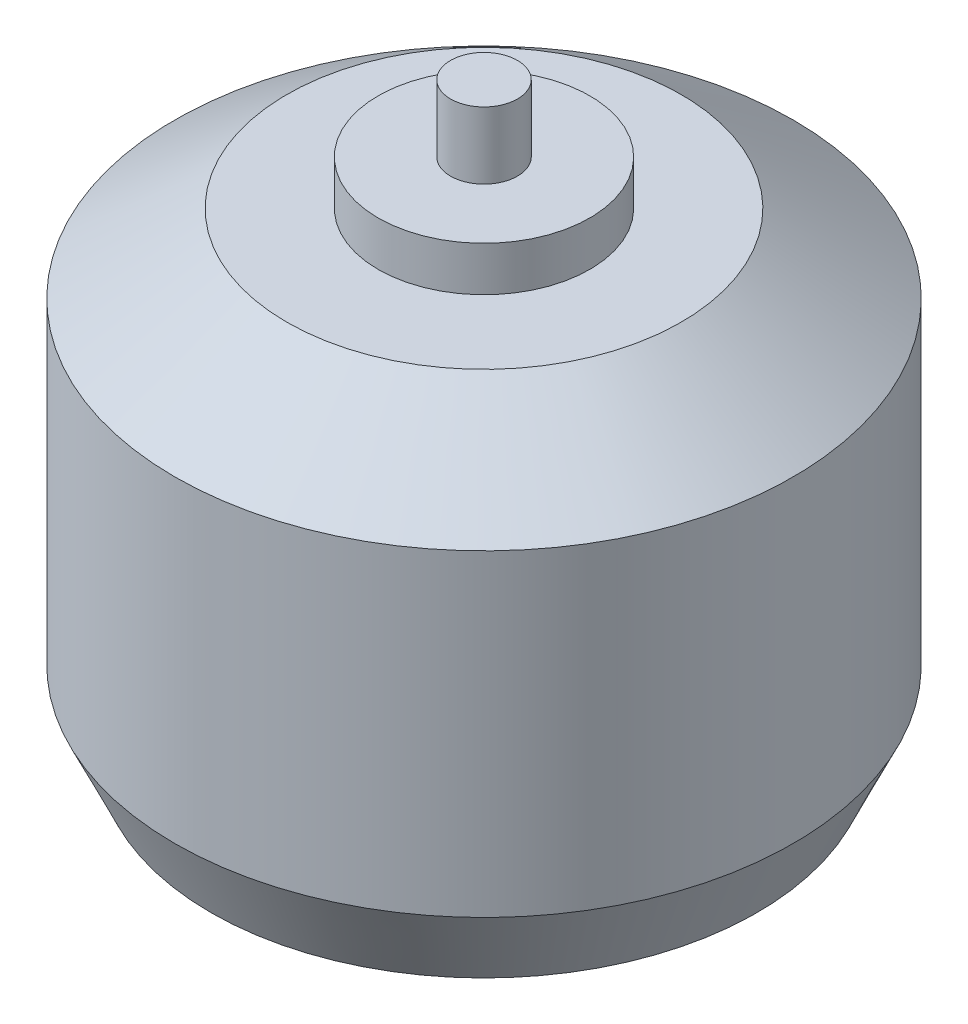
ISO-10303-21;
HEADER;
FILE_DESCRIPTION(('STEP AP214'),'2;1');
FILE_NAME('part.step','',(''),(''),'','','');
FILE_SCHEMA(('AUTOMOTIVE_DESIGN { 1 0 10303 214 1 1 1 1 }'));
ENDSEC;
DATA;
#1=APPLICATION_CONTEXT('core data for automotive mechanical design processes');
#2=APPLICATION_PROTOCOL_DEFINITION('international standard','automotive_design',2000,#1);
#3=PRODUCT_CONTEXT('',#1,'mechanical');
#4=PRODUCT('Part','Part','',(#3));
#5=PRODUCT_RELATED_PRODUCT_CATEGORY('part','',(#4));
#6=PRODUCT_DEFINITION_FORMATION('','',#4);
#7=PRODUCT_DEFINITION_CONTEXT('part definition',#1,'design');
#8=PRODUCT_DEFINITION('design','',#6,#7);
#9=PRODUCT_DEFINITION_SHAPE('','',#8);
#10=(LENGTH_UNIT() NAMED_UNIT(*) SI_UNIT(.MILLI.,.METRE.));
#11=(NAMED_UNIT(*) PLANE_ANGLE_UNIT() SI_UNIT($,.RADIAN.));
#12=(NAMED_UNIT(*) SI_UNIT($,.STERADIAN.) SOLID_ANGLE_UNIT());
#13=UNCERTAINTY_MEASURE_WITH_UNIT(LENGTH_MEASURE(1.E-05),#10,'distance_accuracy_value','');
#14=(GEOMETRIC_REPRESENTATION_CONTEXT(3) GLOBAL_UNCERTAINTY_ASSIGNED_CONTEXT((#13)) GLOBAL_UNIT_ASSIGNED_CONTEXT((#10,
#11,#12)) REPRESENTATION_CONTEXT('',''));
#15=CARTESIAN_POINT('',(0.,0.,0.));
#16=DIRECTION('',(0.,0.,1.));
#17=DIRECTION('',(1.,0.,0.));
#18=AXIS2_PLACEMENT_3D('',#15,#16,#17);
#19=CARTESIAN_POINT('',(0.,0.,0.));
#20=DIRECTION('',(0.,-1.,0.));
#21=DIRECTION('',(0.,0.,-1.));
#22=AXIS2_PLACEMENT_3D('',#19,#20,#21);
#23=PLANE('',#22);
#24=CARTESIAN_POINT('',(0.,0.,0.));
#25=DIRECTION('',(0.,1.,0.));
#26=DIRECTION('',(0.,0.,1.));
#27=AXIS2_PLACEMENT_3D('',#24,#25,#26);
#28=CIRCLE('',#27,12.25);
#29=CARTESIAN_POINT('',(0.,0.,12.25));
#30=VERTEX_POINT('',#29);
#31=EDGE_CURVE('E10',#30,#30,#28,.T.);
#32=ORIENTED_EDGE('',*,*,#31,.F.);
#33=EDGE_LOOP('',(#32));
#34=FACE_BOUND('',#33,.T.);
#35=ADVANCED_FACE('F31',(#34),#23,.T.);
#36=CARTESIAN_POINT('',(0.,3.5,0.));
#37=DIRECTION('',(0.,1.,0.));
#38=DIRECTION('',(0.,0.,1.));
#39=AXIS2_PLACEMENT_3D('',#36,#37,#38);
#40=CONICAL_SURFACE('',#39,13.875,0.434670215149244);
#41=ORIENTED_EDGE('',*,*,#31,.T.);
#42=EDGE_LOOP('',(#41));
#43=FACE_BOUND('',#42,.T.);
#44=CARTESIAN_POINT('',(0.,3.5,0.));
#45=DIRECTION('',(0.,1.,0.));
#46=DIRECTION('',(0.,0.,1.));
#47=AXIS2_PLACEMENT_3D('',#44,#45,#46);
#48=CIRCLE('',#47,13.875);
#49=CARTESIAN_POINT('',(0.,3.5,13.875));
#50=VERTEX_POINT('',#49);
#51=EDGE_CURVE('E37',#50,#50,#48,.T.);
#52=ORIENTED_EDGE('',*,*,#51,.F.);
#53=EDGE_LOOP('',(#52));
#54=FACE_BOUND('',#53,.T.);
#55=ADVANCED_FACE('F79',(#43,#54),#40,.T.);
#56=CARTESIAN_POINT('',(0.,26.25,0.));
#57=DIRECTION('',(0.,1.,0.));
#58=DIRECTION('',(0.,0.,1.));
#59=AXIS2_PLACEMENT_3D('',#56,#57,#58);
#60=CYLINDRICAL_SURFACE('',#59,13.875);
#61=ORIENTED_EDGE('',*,*,#51,.T.);
#62=EDGE_LOOP('',(#61));
#63=FACE_BOUND('',#62,.T.);
#64=CARTESIAN_POINT('',(0.,17.75,0.));
#65=DIRECTION('',(0.,1.,0.));
#66=DIRECTION('',(0.,0.,1.));
#67=AXIS2_PLACEMENT_3D('',#64,#65,#66);
#68=CIRCLE('',#67,13.875);
#69=CARTESIAN_POINT('',(0.,17.75,13.875));
#70=VERTEX_POINT('',#69);
#71=EDGE_CURVE('E41',#70,#70,#68,.T.);
#72=ORIENTED_EDGE('',*,*,#71,.F.);
#73=EDGE_LOOP('',(#72));
#74=FACE_BOUND('',#73,.T.);
#75=ADVANCED_FACE('F84',(#63,#74),#60,.T.);
#76=CARTESIAN_POINT('',(0.,21.25,0.));
#77=DIRECTION('',(0.,-1.,0.));
#78=DIRECTION('',(0.,0.,-1.));
#79=AXIS2_PLACEMENT_3D('',#76,#77,#78);
#80=CONICAL_SURFACE('',#79,8.85,0.96241149525225);
#81=ORIENTED_EDGE('',*,*,#71,.T.);
#82=EDGE_LOOP('',(#81));
#83=FACE_BOUND('',#82,.T.);
#84=CARTESIAN_POINT('',(0.,21.25,0.));
#85=DIRECTION('',(0.,1.,0.));
#86=DIRECTION('',(0.,0.,1.));
#87=AXIS2_PLACEMENT_3D('',#84,#85,#86);
#88=CIRCLE('',#87,8.85);
#89=CARTESIAN_POINT('',(0.,21.25,8.85));
#90=VERTEX_POINT('',#89);
#91=EDGE_CURVE('E45',#90,#90,#88,.T.);
#92=ORIENTED_EDGE('',*,*,#91,.F.);
#93=EDGE_LOOP('',(#92));
#94=FACE_BOUND('',#93,.T.);
#95=ADVANCED_FACE('F88',(#83,#94),#80,.T.);
#96=CARTESIAN_POINT('',(0.,21.25,8.85));
#97=DIRECTION('',(0.,1.,0.));
#98=DIRECTION('',(0.,0.,1.));
#99=AXIS2_PLACEMENT_3D('',#96,#97,#98);
#100=PLANE('',#99);
#101=ORIENTED_EDGE('',*,*,#91,.T.);
#102=EDGE_LOOP('',(#101));
#103=FACE_BOUND('',#102,.T.);
#104=CARTESIAN_POINT('',(0.,21.25,0.));
#105=DIRECTION('',(0.,1.,0.));
#106=DIRECTION('',(0.,0.,1.));
#107=AXIS2_PLACEMENT_3D('',#104,#105,#106);
#108=CIRCLE('',#107,4.75);
#109=CARTESIAN_POINT('',(0.,21.25,4.75));
#110=VERTEX_POINT('',#109);
#111=EDGE_CURVE('E50',#110,#110,#108,.T.);
#112=ORIENTED_EDGE('',*,*,#111,.F.);
#113=EDGE_LOOP('',(#112));
#114=FACE_BOUND('',#113,.T.);
#115=ADVANCED_FACE('F94',(#103,#114),#100,.T.);
#116=CARTESIAN_POINT('',(0.,26.25,0.));
#117=DIRECTION('',(0.,1.,0.));
#118=DIRECTION('',(0.,0.,1.));
#119=AXIS2_PLACEMENT_3D('',#116,#117,#118);
#120=CYLINDRICAL_SURFACE('',#119,4.75);
#121=ORIENTED_EDGE('',*,*,#111,.T.);
#122=EDGE_LOOP('',(#121));
#123=FACE_BOUND('',#122,.T.);
#124=CARTESIAN_POINT('',(0.,23.25,0.));
#125=DIRECTION('',(0.,1.,0.));
#126=DIRECTION('',(0.,0.,1.));
#127=AXIS2_PLACEMENT_3D('',#124,#125,#126);
#128=CIRCLE('',#127,4.75);
#129=CARTESIAN_POINT('',(0.,23.25,4.75));
#130=VERTEX_POINT('',#129);
#131=EDGE_CURVE('E53',#130,#130,#128,.T.);
#132=ORIENTED_EDGE('',*,*,#131,.F.);
#133=EDGE_LOOP('',(#132));
#134=FACE_BOUND('',#133,.T.);
#135=ADVANCED_FACE('F75',(#123,#134),#120,.T.);
#136=CARTESIAN_POINT('',(0.,23.25,4.75));
#137=DIRECTION('',(0.,1.,0.));
#138=DIRECTION('',(0.,0.,1.));
#139=AXIS2_PLACEMENT_3D('',#136,#137,#138);
#140=PLANE('',#139);
#141=ORIENTED_EDGE('',*,*,#131,.T.);
#142=EDGE_LOOP('',(#141));
#143=FACE_BOUND('',#142,.T.);
#144=CARTESIAN_POINT('',(0.,23.25,0.));
#145=DIRECTION('',(0.,1.,0.));
#146=DIRECTION('',(0.,0.,1.));
#147=AXIS2_PLACEMENT_3D('',#144,#145,#146);
#148=CIRCLE('',#147,1.5);
#149=CARTESIAN_POINT('',(0.,23.25,1.5));
#150=VERTEX_POINT('',#149);
#151=EDGE_CURVE('E56',#150,#150,#148,.T.);
#152=ORIENTED_EDGE('',*,*,#151,.F.);
#153=EDGE_LOOP('',(#152));
#154=FACE_BOUND('',#153,.T.);
#155=ADVANCED_FACE('F67',(#143,#154),#140,.T.);
#156=CARTESIAN_POINT('',(0.,26.25,0.));
#157=DIRECTION('',(0.,1.,0.));
#158=DIRECTION('',(0.,0.,1.));
#159=AXIS2_PLACEMENT_3D('',#156,#157,#158);
#160=CYLINDRICAL_SURFACE('',#159,1.5);
#161=ORIENTED_EDGE('',*,*,#151,.T.);
#162=EDGE_LOOP('',(#161));
#163=FACE_BOUND('',#162,.T.);
#164=CARTESIAN_POINT('',(0.,26.25,0.));
#165=DIRECTION('',(0.,1.,0.));
#166=DIRECTION('',(0.,0.,1.));
#167=AXIS2_PLACEMENT_3D('',#164,#165,#166);
#168=CIRCLE('',#167,1.5);
#169=CARTESIAN_POINT('',(0.,26.25,1.5));
#170=VERTEX_POINT('',#169);
#171=EDGE_CURVE('E59',#170,#170,#168,.T.);
#172=ORIENTED_EDGE('',*,*,#171,.F.);
#173=EDGE_LOOP('',(#172));
#174=FACE_BOUND('',#173,.T.);
#175=ADVANCED_FACE('F65',(#163,#174),#160,.T.);
#176=CARTESIAN_POINT('',(0.,26.25,1.5));
#177=DIRECTION('',(0.,1.,0.));
#178=DIRECTION('',(0.,0.,1.));
#179=AXIS2_PLACEMENT_3D('',#176,#177,#178);
#180=PLANE('',#179);
#181=ORIENTED_EDGE('',*,*,#171,.T.);
#182=EDGE_LOOP('',(#181));
#183=FACE_BOUND('',#182,.T.);
#184=ADVANCED_FACE('F63',(#183),#180,.T.);
#185=CLOSED_SHELL('',(#35,#55,#75,#95,#115,#135,#155,#175,#184));
#186=MANIFOLD_SOLID_BREP('B2',#185);
#187=ADVANCED_BREP_SHAPE_REPRESENTATION('',(#18,#186),#14);
#188=SHAPE_DEFINITION_REPRESENTATION(#9,#187);
ENDSEC;
END-ISO-10303-21;
